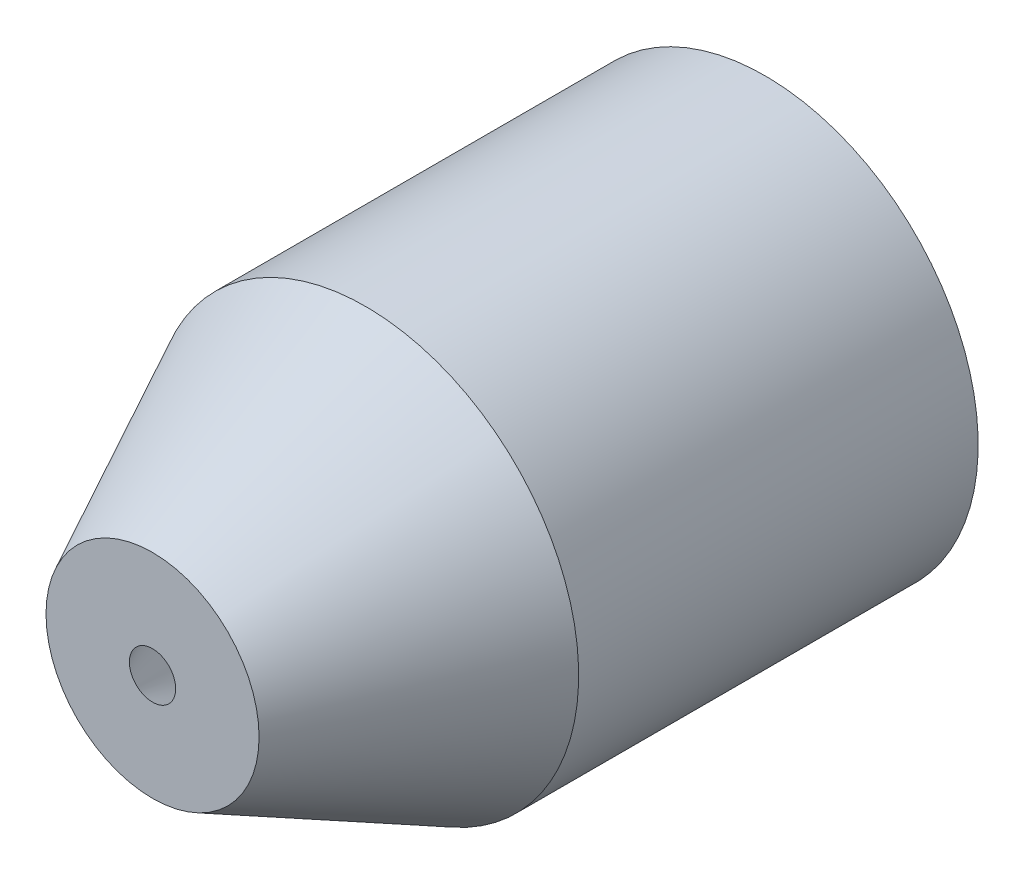
ISO-10303-21;
HEADER;
FILE_DESCRIPTION(('STEP AP214'),'2;1');
FILE_NAME('part.step','',(''),(''),'','','');
FILE_SCHEMA(('AUTOMOTIVE_DESIGN { 1 0 10303 214 1 1 1 1 }'));
ENDSEC;
DATA;
#1=APPLICATION_CONTEXT('core data for automotive mechanical design processes');
#2=APPLICATION_PROTOCOL_DEFINITION('international standard','automotive_design',2000,#1);
#3=PRODUCT_CONTEXT('',#1,'mechanical');
#4=PRODUCT('Part','Part','',(#3));
#5=PRODUCT_RELATED_PRODUCT_CATEGORY('part','',(#4));
#6=PRODUCT_DEFINITION_FORMATION('','',#4);
#7=PRODUCT_DEFINITION_CONTEXT('part definition',#1,'design');
#8=PRODUCT_DEFINITION('design','',#6,#7);
#9=PRODUCT_DEFINITION_SHAPE('','',#8);
#10=(LENGTH_UNIT() NAMED_UNIT(*) SI_UNIT(.MILLI.,.METRE.));
#11=(NAMED_UNIT(*) PLANE_ANGLE_UNIT() SI_UNIT($,.RADIAN.));
#12=(NAMED_UNIT(*) SI_UNIT($,.STERADIAN.) SOLID_ANGLE_UNIT());
#13=UNCERTAINTY_MEASURE_WITH_UNIT(LENGTH_MEASURE(1.E-05),#10,'distance_accuracy_value','');
#14=(GEOMETRIC_REPRESENTATION_CONTEXT(3) GLOBAL_UNCERTAINTY_ASSIGNED_CONTEXT((#13)) GLOBAL_UNIT_ASSIGNED_CONTEXT((#10,
#11,#12)) REPRESENTATION_CONTEXT('',''));
#15=CARTESIAN_POINT('',(0.,0.,0.));
#16=DIRECTION('',(0.,0.,1.));
#17=DIRECTION('',(1.,0.,0.));
#18=AXIS2_PLACEMENT_3D('',#15,#16,#17);
#19=CARTESIAN_POINT('',(0.,0.,13.7478019326001));
#20=DIRECTION('',(0.,0.,-1.));
#21=DIRECTION('',(-1.,0.,0.));
#22=AXIS2_PLACEMENT_3D('',#19,#20,#21);
#23=CONICAL_SURFACE('',#22,5.49560386520023,0.463647609000807);
#24=CARTESIAN_POINT('',(0.,0.,23.));
#25=DIRECTION('',(0.,0.,1.));
#26=DIRECTION('',(1.,0.,0.));
#27=AXIS2_PLACEMENT_3D('',#24,#25,#26);
#28=CIRCLE('',#27,0.869504831500287);
#29=CARTESIAN_POINT('',(-0.869504831500288,0.,23.));
#30=VERTEX_POINT('',#29);
#31=EDGE_CURVE('E72',#30,#30,#28,.F.);
#32=CARTESIAN_POINT('',(0.,0.,15.));
#33=DIRECTION('',(0.,0.,-1.));
#34=DIRECTION('',(-1.,0.,0.));
#35=AXIS2_PLACEMENT_3D('',#32,#33,#34);
#36=CIRCLE('',#35,4.86950483150029);
#37=CARTESIAN_POINT('',(-4.86950483150029,0.,15.));
#38=VERTEX_POINT('',#37);
#39=EDGE_CURVE('E55',#38,#38,#36,.F.);
#40=CARTESIAN_POINT('',(-0.869504831500288,0.,23.));
#41=CARTESIAN_POINT('',(-0.911171498166955,0.,22.9166666666667));
#42=CARTESIAN_POINT('',(-0.952838164833621,0.,22.8333333333333));
#43=CARTESIAN_POINT('',(-1.03617149816695,0.,22.6666666666667));
#44=CARTESIAN_POINT('',(-1.07783816483362,0.,22.5833333333333));
#45=CARTESIAN_POINT('',(-1.16117149816695,0.,22.4166666666667));
#46=CARTESIAN_POINT('',(-1.20283816483362,0.,22.3333333333333));
#47=CARTESIAN_POINT('',(-1.28617149816695,0.,22.1666666666667));
#48=CARTESIAN_POINT('',(-1.32783816483362,0.,22.0833333333333));
#49=CARTESIAN_POINT('',(-1.41117149816696,0.,21.9166666666667));
#50=CARTESIAN_POINT('',(-1.45283816483362,0.,21.8333333333333));
#51=CARTESIAN_POINT('',(-1.53617149816696,0.,21.6666666666667));
#52=CARTESIAN_POINT('',(-1.57783816483362,0.,21.5833333333333));
#53=CARTESIAN_POINT('',(-1.66117149816696,0.,21.4166666666667));
#54=CARTESIAN_POINT('',(-1.70283816483362,0.,21.3333333333333));
#55=CARTESIAN_POINT('',(-1.78617149816696,0.,21.1666666666667));
#56=CARTESIAN_POINT('',(-1.82783816483362,0.,21.0833333333333));
#57=CARTESIAN_POINT('',(-1.91117149816696,0.,20.9166666666667));
#58=CARTESIAN_POINT('',(-1.95283816483362,0.,20.8333333333333));
#59=CARTESIAN_POINT('',(-2.03617149816696,0.,20.6666666666667));
#60=CARTESIAN_POINT('',(-2.07783816483362,0.,20.5833333333333));
#61=CARTESIAN_POINT('',(-2.16117149816696,0.,20.4166666666667));
#62=CARTESIAN_POINT('',(-2.20283816483362,0.,20.3333333333333));
#63=CARTESIAN_POINT('',(-2.28617149816696,0.,20.1666666666667));
#64=CARTESIAN_POINT('',(-2.32783816483362,0.,20.0833333333333));
#65=CARTESIAN_POINT('',(-2.41117149816696,0.,19.9166666666667));
#66=CARTESIAN_POINT('',(-2.45283816483362,0.,19.8333333333333));
#67=CARTESIAN_POINT('',(-2.53617149816696,0.,19.6666666666667));
#68=CARTESIAN_POINT('',(-2.57783816483362,0.,19.5833333333333));
#69=CARTESIAN_POINT('',(-2.66117149816696,0.,19.4166666666667));
#70=CARTESIAN_POINT('',(-2.70283816483362,0.,19.3333333333333));
#71=CARTESIAN_POINT('',(-2.78617149816696,0.,19.1666666666667));
#72=CARTESIAN_POINT('',(-2.82783816483362,0.,19.0833333333333));
#73=CARTESIAN_POINT('',(-2.91117149816696,0.,18.9166666666667));
#74=CARTESIAN_POINT('',(-2.95283816483362,0.,18.8333333333333));
#75=CARTESIAN_POINT('',(-3.03617149816696,0.,18.6666666666667));
#76=CARTESIAN_POINT('',(-3.07783816483362,0.,18.5833333333333));
#77=CARTESIAN_POINT('',(-3.16117149816696,0.,18.4166666666667));
#78=CARTESIAN_POINT('',(-3.20283816483362,0.,18.3333333333333));
#79=CARTESIAN_POINT('',(-3.28617149816696,0.,18.1666666666667));
#80=CARTESIAN_POINT('',(-3.32783816483362,0.,18.0833333333333));
#81=CARTESIAN_POINT('',(-3.41117149816696,0.,17.9166666666667));
#82=CARTESIAN_POINT('',(-3.45283816483362,0.,17.8333333333333));
#83=CARTESIAN_POINT('',(-3.53617149816696,0.,17.6666666666667));
#84=CARTESIAN_POINT('',(-3.57783816483362,0.,17.5833333333333));
#85=CARTESIAN_POINT('',(-3.66117149816696,0.,17.4166666666667));
#86=CARTESIAN_POINT('',(-3.70283816483362,0.,17.3333333333333));
#87=CARTESIAN_POINT('',(-3.78617149816696,0.,17.1666666666667));
#88=CARTESIAN_POINT('',(-3.82783816483362,0.,17.0833333333333));
#89=CARTESIAN_POINT('',(-3.91117149816696,0.,16.9166666666667));
#90=CARTESIAN_POINT('',(-3.95283816483362,0.,16.8333333333333));
#91=CARTESIAN_POINT('',(-4.03617149816696,0.,16.6666666666667));
#92=CARTESIAN_POINT('',(-4.07783816483362,0.,16.5833333333333));
#93=CARTESIAN_POINT('',(-4.16117149816696,0.,16.4166666666667));
#94=CARTESIAN_POINT('',(-4.20283816483362,0.,16.3333333333333));
#95=CARTESIAN_POINT('',(-4.28617149816696,0.,16.1666666666667));
#96=CARTESIAN_POINT('',(-4.32783816483362,0.,16.0833333333333));
#97=CARTESIAN_POINT('',(-4.41117149816696,0.,15.9166666666667));
#98=CARTESIAN_POINT('',(-4.45283816483362,0.,15.8333333333333));
#99=CARTESIAN_POINT('',(-4.53617149816696,0.,15.6666666666667));
#100=CARTESIAN_POINT('',(-4.57783816483362,0.,15.5833333333333));
#101=CARTESIAN_POINT('',(-4.66117149816696,0.,15.4166666666667));
#102=CARTESIAN_POINT('',(-4.70283816483362,0.,15.3333333333333));
#103=CARTESIAN_POINT('',(-4.78617149816696,0.,15.1666666666667));
#104=CARTESIAN_POINT('',(-4.82783816483362,0.,15.0833333333333));
#105=CARTESIAN_POINT('',(-4.86950483150029,0.,15.));
#106=B_SPLINE_CURVE_WITH_KNOTS('',3,(#40,#41,#42,#43,#44,#45,#46,#47,#48,#49,#50,#51,#52,#53,
#54,#55,#56,#57,#58,#59,#60,#61,#62,#63,#64,#65,#66,#67,#68,#69,#70,#71,#72,#73,#74,#75,#76,#77,
#78,#79,#80,#81,#82,#83,#84,#85,#86,#87,#88,#89,#90,#91,#92,#93,#94,#95,#96,#97,#98,#99,#100,
#101,#102,#103,#104,#105),.UNSPECIFIED.,.F.,.F.,(4,2,2,2,2,2,2,2,2,2,2,2,2,2,2,2,2,2,2,2,2,2,2,
2,2,2,2,2,2,2,2,2,4),(0.,0.279508497187474,0.559016994374948,0.838525491562419,1.11803398874989,
1.39754248593737,1.67705098312484,1.95655948031231,2.23606797749979,2.51557647468726,
2.79508497187474,3.07459346906221,3.35410196624968,3.63361046343716,3.91311896062463,
4.19262745781211,4.47213595499958,4.75164445218705,5.03115294937453,5.310661446562,
5.59016994374947,5.86967844093695,6.14918693812442,6.42869543531189,6.70820393249937,
6.98771242968684,7.26722092687431,7.54672942406179,7.82623792124926,8.10574641843674,
8.38525491562421,8.66476341281168,8.94427190999916),.UNSPECIFIED.);
#107=EDGE_CURVE('BSEAM39',#30,#38,#106,.T.);
#108=ORIENTED_EDGE('',*,*,#31,.F.);
#109=ORIENTED_EDGE('',*,*,#39,.F.);
#110=ORIENTED_EDGE('',*,*,#107,.T.);
#111=ORIENTED_EDGE('',*,*,#107,.F.);
#112=EDGE_LOOP('',(#108,#110,#109,#111));
#113=FACE_BOUND('',#112,.T.);
#114=ADVANCED_FACE('F39',(#113),#23,.F.);
#115=CARTESIAN_POINT('',(0.,0.,0.));
#116=DIRECTION('',(0.,0.,-1.));
#117=DIRECTION('',(-1.,0.,0.));
#118=AXIS2_PLACEMENT_3D('',#115,#116,#117);
#119=PLANE('',#118);
#120=CARTESIAN_POINT('',(0.,0.,0.));
#121=DIRECTION('',(0.,0.,-1.));
#122=DIRECTION('',(-1.,0.,0.));
#123=AXIS2_PLACEMENT_3D('',#120,#121,#122);
#124=CIRCLE('',#123,5.1);
#125=CARTESIAN_POINT('',(-5.1,0.,0.));
#126=VERTEX_POINT('',#125);
#127=EDGE_CURVE('E63',#126,#126,#124,.T.);
#128=ORIENTED_EDGE('',*,*,#127,.F.);
#129=EDGE_LOOP('',(#128));
#130=FACE_BOUND('',#129,.T.);
#131=CARTESIAN_POINT('',(0.,0.,0.));
#132=DIRECTION('',(0.,0.,-1.));
#133=DIRECTION('',(-1.,0.,0.));
#134=AXIS2_PLACEMENT_3D('',#131,#132,#133);
#135=CIRCLE('',#134,8.);
#136=CARTESIAN_POINT('',(-8.,0.,0.));
#137=VERTEX_POINT('',#136);
#138=EDGE_CURVE('E10',#137,#137,#135,.T.);
#139=ORIENTED_EDGE('',*,*,#138,.T.);
#140=EDGE_LOOP('',(#139));
#141=FACE_BOUND('',#140,.T.);
#142=ADVANCED_FACE('F41',(#130,#141),#119,.T.);
#143=CARTESIAN_POINT('',(0.,0.,-36.0459770114943));
#144=DIRECTION('',(0.,0.,-1.));
#145=DIRECTION('',(-1.,0.,0.));
#146=AXIS2_PLACEMENT_3D('',#143,#144,#145);
#147=CYLINDRICAL_SURFACE('',#146,8.);
#148=CARTESIAN_POINT('',(0.,0.,15.));
#149=DIRECTION('',(0.,0.,-1.));
#150=DIRECTION('',(-1.,0.,0.));
#151=AXIS2_PLACEMENT_3D('',#148,#149,#150);
#152=CIRCLE('',#151,8.);
#153=CARTESIAN_POINT('',(-8.,0.,15.));
#154=VERTEX_POINT('',#153);
#155=EDGE_CURVE('E47',#154,#154,#152,.T.);
#156=ORIENTED_EDGE('',*,*,#155,.T.);
#157=EDGE_LOOP('',(#156));
#158=FACE_BOUND('',#157,.T.);
#159=ORIENTED_EDGE('',*,*,#138,.F.);
#160=EDGE_LOOP('',(#159));
#161=FACE_BOUND('',#160,.T.);
#162=ADVANCED_FACE('F98',(#158,#161),#147,.T.);
#163=CARTESIAN_POINT('',(0.,0.,15.));
#164=DIRECTION('',(0.,0.,-1.));
#165=DIRECTION('',(-1.,0.,0.));
#166=AXIS2_PLACEMENT_3D('',#163,#164,#165);
#167=CONICAL_SURFACE('',#166,8.,0.463647609000807);
#168=CARTESIAN_POINT('',(0.,0.,23.));
#169=DIRECTION('',(0.,0.,-1.));
#170=DIRECTION('',(-1.,0.,0.));
#171=AXIS2_PLACEMENT_3D('',#168,#169,#170);
#172=CIRCLE('',#171,3.99999999999999);
#173=CARTESIAN_POINT('',(-3.99999999999999,0.,23.));
#174=VERTEX_POINT('',#173);
#175=EDGE_CURVE('E52',#174,#174,#172,.T.);
#176=ORIENTED_EDGE('',*,*,#175,.T.);
#177=EDGE_LOOP('',(#176));
#178=FACE_BOUND('',#177,.T.);
#179=ORIENTED_EDGE('',*,*,#155,.F.);
#180=EDGE_LOOP('',(#179));
#181=FACE_BOUND('',#180,.T.);
#182=ADVANCED_FACE('F83',(#178,#181),#167,.T.);
#183=CARTESIAN_POINT('',(-3.99999999999999,0.,23.));
#184=DIRECTION('',(0.,0.,1.));
#185=DIRECTION('',(1.,0.,0.));
#186=AXIS2_PLACEMENT_3D('',#183,#184,#185);
#187=PLANE('',#186);
#188=ORIENTED_EDGE('',*,*,#31,.T.);
#189=EDGE_LOOP('',(#188));
#190=FACE_BOUND('',#189,.T.);
#191=ORIENTED_EDGE('',*,*,#175,.F.);
#192=EDGE_LOOP('',(#191));
#193=FACE_BOUND('',#192,.T.);
#194=ADVANCED_FACE('F86',(#190,#193),#187,.T.);
#195=CARTESIAN_POINT('',(0.,0.,15.));
#196=DIRECTION('',(0.,0.,-1.));
#197=DIRECTION('',(-1.,0.,0.));
#198=AXIS2_PLACEMENT_3D('',#195,#196,#197);
#199=PLANE('',#198);
#200=CARTESIAN_POINT('',(0.,0.,15.));
#201=DIRECTION('',(0.,0.,-1.));
#202=DIRECTION('',(-1.,0.,0.));
#203=AXIS2_PLACEMENT_3D('',#200,#201,#202);
#204=CIRCLE('',#203,5.1);
#205=CARTESIAN_POINT('',(-5.1,0.,15.));
#206=VERTEX_POINT('',#205);
#207=EDGE_CURVE('E57',#206,#206,#204,.T.);
#208=ORIENTED_EDGE('',*,*,#207,.T.);
#209=EDGE_LOOP('',(#208));
#210=FACE_BOUND('',#209,.T.);
#211=ORIENTED_EDGE('',*,*,#39,.T.);
#212=EDGE_LOOP('',(#211));
#213=FACE_BOUND('',#212,.T.);
#214=ADVANCED_FACE('F88',(#210,#213),#199,.T.);
#215=CARTESIAN_POINT('',(0.,0.,15.));
#216=DIRECTION('',(0.,0.,-1.));
#217=DIRECTION('',(-1.,0.,0.));
#218=AXIS2_PLACEMENT_3D('',#215,#216,#217);
#219=CYLINDRICAL_SURFACE('',#218,5.1);
#220=ORIENTED_EDGE('',*,*,#207,.F.);
#221=EDGE_LOOP('',(#220));
#222=FACE_BOUND('',#221,.T.);
#223=CARTESIAN_POINT('',(0.,0.,14.5390096630006));
#224=DIRECTION('',(0.,0.,-1.));
#225=DIRECTION('',(-1.,0.,0.));
#226=AXIS2_PLACEMENT_3D('',#223,#224,#225);
#227=CIRCLE('',#226,5.1);
#228=CARTESIAN_POINT('',(-5.1,0.,14.5390096630006));
#229=VERTEX_POINT('',#228);
#230=EDGE_CURVE('E43',#229,#229,#227,.F.);
#231=ORIENTED_EDGE('',*,*,#230,.F.);
#232=EDGE_LOOP('',(#231));
#233=FACE_BOUND('',#232,.T.);
#234=ADVANCED_FACE('F96',(#222,#233),#219,.F.);
#235=CARTESIAN_POINT('',(0.,0.,2.8));
#236=DIRECTION('',(0.,0.,-1.));
#237=DIRECTION('',(-1.,0.,0.));
#238=AXIS2_PLACEMENT_3D('',#235,#236,#237);
#239=PLANE('',#238);
#240=CARTESIAN_POINT('',(0.,0.,2.8));
#241=DIRECTION('',(0.,0.,-1.));
#242=DIRECTION('',(-1.,0.,0.));
#243=AXIS2_PLACEMENT_3D('',#240,#241,#242);
#244=CIRCLE('',#243,5.1);
#245=CARTESIAN_POINT('',(-5.1,0.,2.8));
#246=VERTEX_POINT('',#245);
#247=EDGE_CURVE('E61',#246,#246,#244,.T.);
#248=ORIENTED_EDGE('',*,*,#247,.T.);
#249=EDGE_LOOP('',(#248));
#250=FACE_BOUND('',#249,.T.);
#251=CARTESIAN_POINT('',(0.,0.,2.8));
#252=DIRECTION('',(0.,0.,-1.));
#253=DIRECTION('',(-1.,0.,0.));
#254=AXIS2_PLACEMENT_3D('',#251,#252,#253);
#255=CIRCLE('',#254,5.2);
#256=CARTESIAN_POINT('',(-5.2,0.,2.8));
#257=VERTEX_POINT('',#256);
#258=EDGE_CURVE('E73',#257,#257,#255,.T.);
#259=ORIENTED_EDGE('',*,*,#258,.F.);
#260=EDGE_LOOP('',(#259));
#261=FACE_BOUND('',#260,.T.);
#262=ADVANCED_FACE('F121',(#250,#261),#239,.F.);
#263=CARTESIAN_POINT('',(0.,0.,-36.0459770114943));
#264=DIRECTION('',(0.,0.,-1.));
#265=DIRECTION('',(-1.,0.,0.));
#266=AXIS2_PLACEMENT_3D('',#263,#264,#265);
#267=CYLINDRICAL_SURFACE('',#266,5.2);
#268=CARTESIAN_POINT('',(0.,0.,14.3390096630006));
#269=DIRECTION('',(0.,0.,-1.));
#270=DIRECTION('',(-1.,0.,0.));
#271=AXIS2_PLACEMENT_3D('',#268,#269,#270);
#272=CIRCLE('',#271,5.2);
#273=CARTESIAN_POINT('',(-5.2,0.,14.3390096630006));
#274=VERTEX_POINT('',#273);
#275=EDGE_CURVE('E76',#274,#274,#272,.T.);
#276=ORIENTED_EDGE('',*,*,#275,.F.);
#277=EDGE_LOOP('',(#276));
#278=FACE_BOUND('',#277,.T.);
#279=ORIENTED_EDGE('',*,*,#258,.T.);
#280=EDGE_LOOP('',(#279));
#281=FACE_BOUND('',#280,.T.);
#282=ADVANCED_FACE('F113',(#278,#281),#267,.F.);
#283=ORIENTED_EDGE('',*,*,#230,.T.);
#284=EDGE_LOOP('',(#283));
#285=FACE_BOUND('',#284,.T.);
#286=ORIENTED_EDGE('',*,*,#275,.T.);
#287=EDGE_LOOP('',(#286));
#288=FACE_BOUND('',#287,.T.);
#289=ADVANCED_FACE('F103',(#285,#288),#23,.F.);
#290=ORIENTED_EDGE('',*,*,#127,.T.);
#291=EDGE_LOOP('',(#290));
#292=FACE_BOUND('',#291,.T.);
#293=ORIENTED_EDGE('',*,*,#247,.F.);
#294=EDGE_LOOP('',(#293));
#295=FACE_BOUND('',#294,.T.);
#296=ADVANCED_FACE('F112',(#292,#295),#219,.F.);
#297=CLOSED_SHELL('',(#114,#142,#162,#182,#194,#214,#234,#262,#282,#289,#296));
#298=MANIFOLD_SOLID_BREP('B2',#297);
#299=ADVANCED_BREP_SHAPE_REPRESENTATION('',(#18,#298),#14);
#300=SHAPE_DEFINITION_REPRESENTATION(#9,#299);
ENDSEC;
END-ISO-10303-21;
